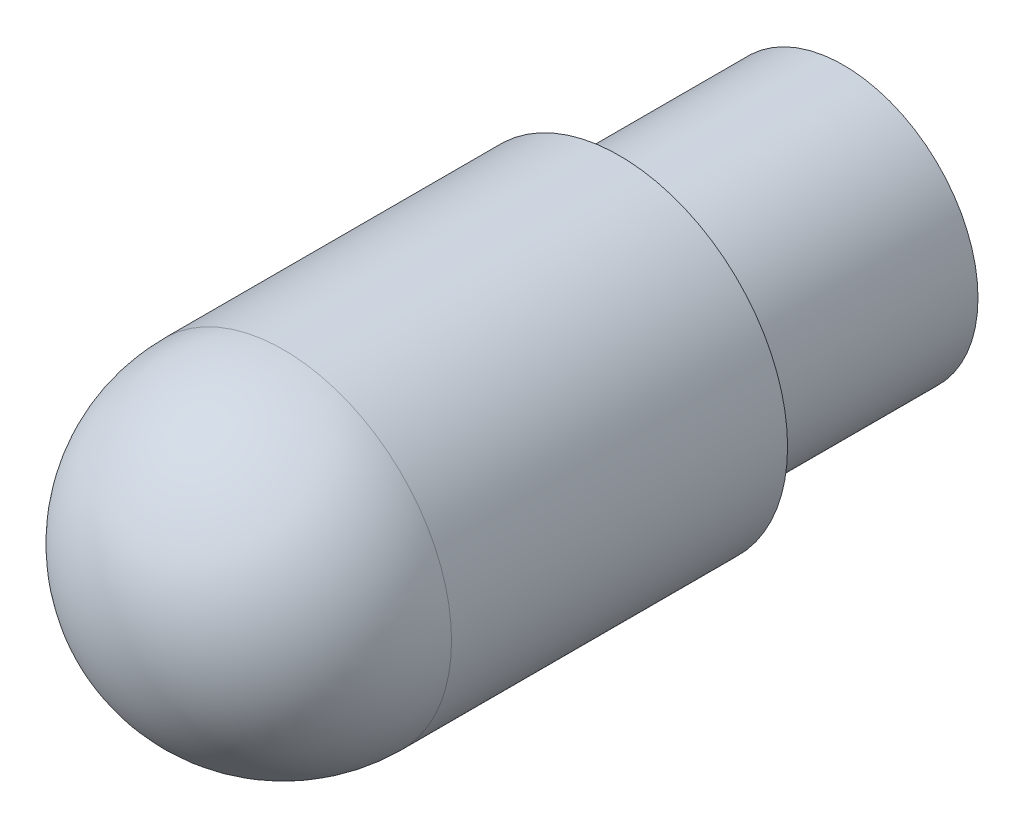
ISO-10303-21;
HEADER;
FILE_DESCRIPTION(('STEP AP214'),'2;1');
FILE_NAME('part.step','',(''),(''),'','','');
FILE_SCHEMA(('AUTOMOTIVE_DESIGN { 1 0 10303 214 1 1 1 1 }'));
ENDSEC;
DATA;
#1=APPLICATION_CONTEXT('core data for automotive mechanical design processes');
#2=APPLICATION_PROTOCOL_DEFINITION('international standard','automotive_design',2000,#1);
#3=PRODUCT_CONTEXT('',#1,'mechanical');
#4=PRODUCT('Part','Part','',(#3));
#5=PRODUCT_RELATED_PRODUCT_CATEGORY('part','',(#4));
#6=PRODUCT_DEFINITION_FORMATION('','',#4);
#7=PRODUCT_DEFINITION_CONTEXT('part definition',#1,'design');
#8=PRODUCT_DEFINITION('design','',#6,#7);
#9=PRODUCT_DEFINITION_SHAPE('','',#8);
#10=(LENGTH_UNIT() NAMED_UNIT(*) SI_UNIT(.MILLI.,.METRE.));
#11=(NAMED_UNIT(*) PLANE_ANGLE_UNIT() SI_UNIT($,.RADIAN.));
#12=(NAMED_UNIT(*) SI_UNIT($,.STERADIAN.) SOLID_ANGLE_UNIT());
#13=UNCERTAINTY_MEASURE_WITH_UNIT(LENGTH_MEASURE(1.E-05),#10,'distance_accuracy_value','');
#14=(GEOMETRIC_REPRESENTATION_CONTEXT(3) GLOBAL_UNCERTAINTY_ASSIGNED_CONTEXT((#13)) GLOBAL_UNIT_ASSIGNED_CONTEXT((#10,
#11,#12)) REPRESENTATION_CONTEXT('',''));
#15=CARTESIAN_POINT('',(0.,0.,0.));
#16=DIRECTION('',(0.,0.,1.));
#17=DIRECTION('',(1.,0.,0.));
#18=AXIS2_PLACEMENT_3D('',#15,#16,#17);
#19=CARTESIAN_POINT('',(0.,0.,0.));
#20=DIRECTION('',(0.,0.,-1.));
#21=DIRECTION('',(-1.,0.,0.));
#22=AXIS2_PLACEMENT_3D('',#19,#20,#21);
#23=SPHERICAL_SURFACE('',#22,7.5);
#24=CARTESIAN_POINT('',(0.,0.,0.));
#25=DIRECTION('',(0.,0.,-1.));
#26=DIRECTION('',(-1.,0.,0.));
#27=AXIS2_PLACEMENT_3D('',#24,#25,#26);
#28=CIRCLE('',#27,7.5);
#29=CARTESIAN_POINT('',(-7.5,0.,0.));
#30=VERTEX_POINT('',#29);
#31=EDGE_CURVE('E47',#30,#30,#28,.T.);
#32=ORIENTED_EDGE('',*,*,#31,.F.);
#33=EDGE_LOOP('',(#32));
#34=FACE_BOUND('',#33,.T.);
#35=ADVANCED_FACE('F33',(#34),#23,.T.);
#36=CARTESIAN_POINT('',(0.,0.,-25.));
#37=DIRECTION('',(0.,0.,-1.));
#38=DIRECTION('',(-1.,0.,0.));
#39=AXIS2_PLACEMENT_3D('',#36,#37,#38);
#40=PLANE('',#39);
#41=CARTESIAN_POINT('',(0.,0.,-25.));
#42=DIRECTION('',(0.,0.,-1.));
#43=DIRECTION('',(-1.,0.,0.));
#44=AXIS2_PLACEMENT_3D('',#41,#42,#43);
#45=CIRCLE('',#44,6.);
#46=CARTESIAN_POINT('',(-6.,0.,-25.));
#47=VERTEX_POINT('',#46);
#48=EDGE_CURVE('E10',#47,#47,#45,.T.);
#49=ORIENTED_EDGE('',*,*,#48,.T.);
#50=EDGE_LOOP('',(#49));
#51=FACE_BOUND('',#50,.T.);
#52=ADVANCED_FACE('F56',(#51),#40,.T.);
#53=CARTESIAN_POINT('',(0.,0.,-15.));
#54=DIRECTION('',(0.,0.,-1.));
#55=DIRECTION('',(-1.,0.,0.));
#56=AXIS2_PLACEMENT_3D('',#53,#54,#55);
#57=CYLINDRICAL_SURFACE('',#56,6.);
#58=CARTESIAN_POINT('',(0.,0.,-15.));
#59=DIRECTION('',(0.,0.,-1.));
#60=DIRECTION('',(-1.,0.,0.));
#61=AXIS2_PLACEMENT_3D('',#58,#59,#60);
#62=CIRCLE('',#61,6.);
#63=CARTESIAN_POINT('',(-6.,0.,-15.));
#64=VERTEX_POINT('',#63);
#65=EDGE_CURVE('E39',#64,#64,#62,.T.);
#66=ORIENTED_EDGE('',*,*,#65,.T.);
#67=EDGE_LOOP('',(#66));
#68=FACE_BOUND('',#67,.T.);
#69=ORIENTED_EDGE('',*,*,#48,.F.);
#70=EDGE_LOOP('',(#69));
#71=FACE_BOUND('',#70,.T.);
#72=ADVANCED_FACE('F60',(#68,#71),#57,.T.);
#73=CARTESIAN_POINT('',(-7.5,0.,-15.));
#74=DIRECTION('',(0.,0.,1.));
#75=DIRECTION('',(1.,0.,0.));
#76=AXIS2_PLACEMENT_3D('',#73,#74,#75);
#77=PLANE('',#76);
#78=ORIENTED_EDGE('',*,*,#65,.F.);
#79=EDGE_LOOP('',(#78));
#80=FACE_BOUND('',#79,.T.);
#81=CARTESIAN_POINT('',(0.,0.,-15.));
#82=DIRECTION('',(0.,0.,-1.));
#83=DIRECTION('',(-1.,0.,0.));
#84=AXIS2_PLACEMENT_3D('',#81,#82,#83);
#85=CIRCLE('',#84,7.5);
#86=CARTESIAN_POINT('',(-7.5,0.,-15.));
#87=VERTEX_POINT('',#86);
#88=EDGE_CURVE('E43',#87,#87,#85,.T.);
#89=ORIENTED_EDGE('',*,*,#88,.T.);
#90=EDGE_LOOP('',(#89));
#91=FACE_BOUND('',#90,.T.);
#92=ADVANCED_FACE('F64',(#80,#91),#77,.F.);
#93=CARTESIAN_POINT('',(0.,0.,-15.));
#94=DIRECTION('',(0.,0.,-1.));
#95=DIRECTION('',(-1.,0.,0.));
#96=AXIS2_PLACEMENT_3D('',#93,#94,#95);
#97=CYLINDRICAL_SURFACE('',#96,7.5);
#98=ORIENTED_EDGE('',*,*,#88,.F.);
#99=EDGE_LOOP('',(#98));
#100=FACE_BOUND('',#99,.T.);
#101=ORIENTED_EDGE('',*,*,#31,.T.);
#102=EDGE_LOOP('',(#101));
#103=FACE_BOUND('',#102,.T.);
#104=ADVANCED_FACE('F53',(#100,#103),#97,.T.);
#105=CLOSED_SHELL('',(#35,#52,#72,#92,#104));
#106=MANIFOLD_SOLID_BREP('B2',#105);
#107=ADVANCED_BREP_SHAPE_REPRESENTATION('',(#18,#106),#14);
#108=SHAPE_DEFINITION_REPRESENTATION(#9,#107);
ENDSEC;
END-ISO-10303-21;
